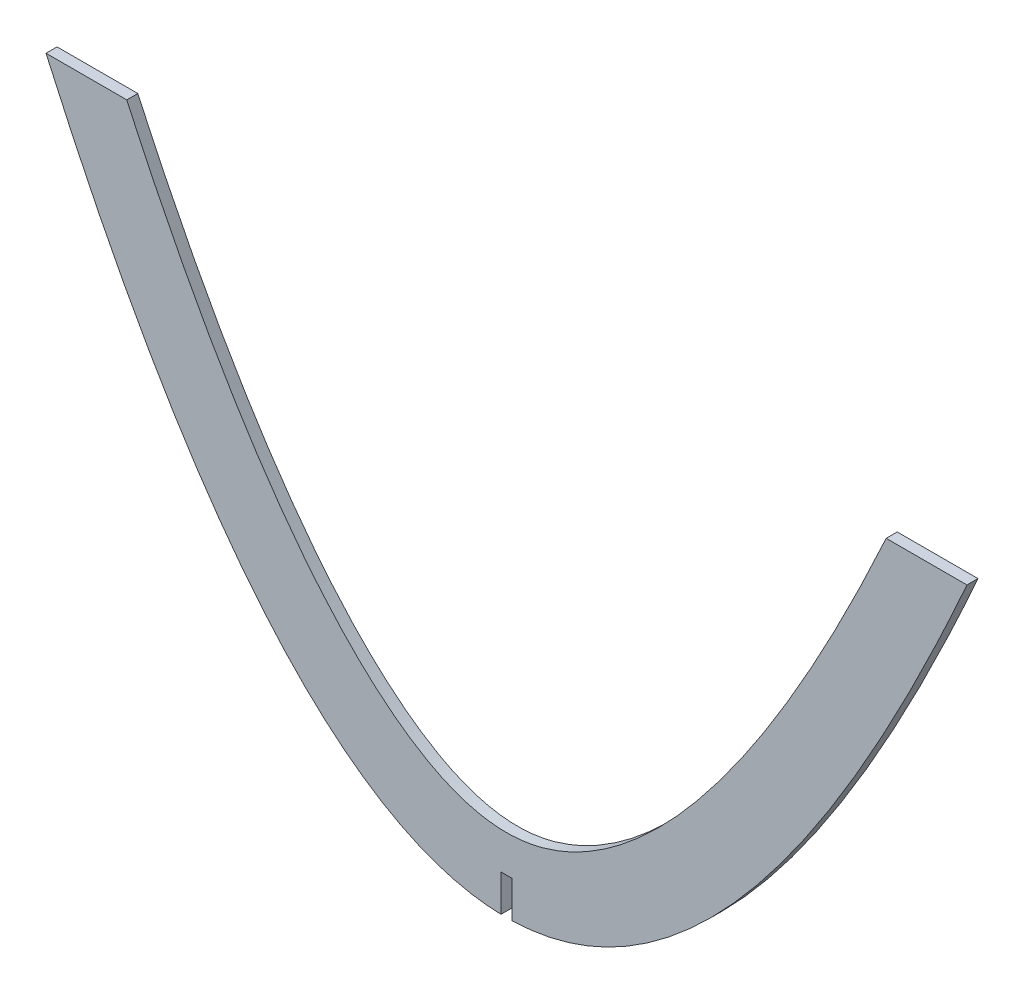
ISO-10303-21;
HEADER;
FILE_DESCRIPTION(('STEP AP214'),'2;1');
FILE_NAME('part.step','',(''),(''),'','','');
FILE_SCHEMA(('AUTOMOTIVE_DESIGN { 1 0 10303 214 1 1 1 1 }'));
ENDSEC;
DATA;
#1=APPLICATION_CONTEXT('core data for automotive mechanical design processes');
#2=APPLICATION_PROTOCOL_DEFINITION('international standard','automotive_design',2000,#1);
#3=PRODUCT_CONTEXT('',#1,'mechanical');
#4=PRODUCT('Part','Part','',(#3));
#5=PRODUCT_RELATED_PRODUCT_CATEGORY('part','',(#4));
#6=PRODUCT_DEFINITION_FORMATION('','',#4);
#7=PRODUCT_DEFINITION_CONTEXT('part definition',#1,'design');
#8=PRODUCT_DEFINITION('design','',#6,#7);
#9=PRODUCT_DEFINITION_SHAPE('','',#8);
#10=(LENGTH_UNIT() NAMED_UNIT(*) SI_UNIT(.MILLI.,.METRE.));
#11=(NAMED_UNIT(*) PLANE_ANGLE_UNIT() SI_UNIT($,.RADIAN.));
#12=(NAMED_UNIT(*) SI_UNIT($,.STERADIAN.) SOLID_ANGLE_UNIT());
#13=UNCERTAINTY_MEASURE_WITH_UNIT(LENGTH_MEASURE(1.E-05),#10,'distance_accuracy_value','');
#14=(GEOMETRIC_REPRESENTATION_CONTEXT(3) GLOBAL_UNCERTAINTY_ASSIGNED_CONTEXT((#13)) GLOBAL_UNIT_ASSIGNED_CONTEXT((#10,
#11,#12)) REPRESENTATION_CONTEXT('',''));
#15=CARTESIAN_POINT('',(0.,0.,0.));
#16=DIRECTION('',(0.,0.,1.));
#17=DIRECTION('',(1.,0.,0.));
#18=AXIS2_PLACEMENT_3D('',#15,#16,#17);
#19=CARTESIAN_POINT('',(-125.077753595806,140.800000001159,3.));
#20=CARTESIAN_POINT('',(-3.81221096357187E-10,-140.800000000301,3.));
#21=CARTESIAN_POINT('',(125.077753595044,140.799999999443,3.));
#22=B_SPLINE_CURVE_WITH_KNOTS('',2,(#19,#20,#21),.UNSPECIFIED.,.F.,.F.,(3,3),
(0.0543815127993418,0.945618487197942),.UNSPECIFIED.);
#23=DIRECTION('',(0.,0.,-1.));
#24=VECTOR('',#23,1.);
#25=SURFACE_OF_LINEAR_EXTRUSION('',#22,#24);
#26=DIRECTION('',(0.,0.,-1.));
#27=VECTOR('',#26,1.);
#28=CARTESIAN_POINT('',(-1.50000000000001,0.0202499999999815,3.));
#29=LINE('',#28,#27);
#30=CARTESIAN_POINT('',(-1.5,0.0202499999999821,3.));
#31=VERTEX_POINT('',#30);
#32=CARTESIAN_POINT('',(-1.5,0.0202499999999856,0.));
#33=VERTEX_POINT('',#32);
#34=EDGE_CURVE('E174',#31,#33,#29,.T.);
#35=ORIENTED_EDGE('',*,*,#34,.F.);
#36=CARTESIAN_POINT('',(-125.077753595764,140.800000001063,3.));
#37=VERTEX_POINT('',#36);
#38=EDGE_CURVE('E186',#37,#31,#22,.T.);
#39=ORIENTED_EDGE('',*,*,#38,.F.);
#40=DIRECTION('',(0.,0.,-1.));
#41=VECTOR('',#40,1.);
#42=CARTESIAN_POINT('',(-125.077753595764,140.800000001063,3.));
#43=LINE('',#42,#41);
#44=CARTESIAN_POINT('',(-125.077753595764,140.800000001063,0.));
#45=VERTEX_POINT('',#44);
#46=EDGE_CURVE('E164',#37,#45,#43,.T.);
#47=ORIENTED_EDGE('',*,*,#46,.T.);
#48=CARTESIAN_POINT('',(-125.077753595806,140.800000001159,0.));
#49=CARTESIAN_POINT('',(-3.81221096357187E-10,-140.800000000301,0.));
#50=CARTESIAN_POINT('',(125.077753595044,140.799999999443,0.));
#51=B_SPLINE_CURVE_WITH_KNOTS('',2,(#48,#49,#50),.UNSPECIFIED.,.F.,.F.,(3,3),
(0.0543815127993418,0.945618487197942),.UNSPECIFIED.);
#52=EDGE_CURVE('E140',#45,#33,#51,.T.);
#53=ORIENTED_EDGE('',*,*,#52,.T.);
#54=EDGE_LOOP('',(#35,#39,#47,#53));
#55=FACE_BOUND('',#54,.T.);
#56=ADVANCED_FACE('F38',(#55),#25,.F.);
#57=DIRECTION('',(0.,0.,-1.));
#58=VECTOR('',#57,1.);
#59=CARTESIAN_POINT('',(1.49999999999998,0.0202499999999831,3.));
#60=LINE('',#59,#58);
#61=CARTESIAN_POINT('',(1.5,0.020249999999989,0.));
#62=VERTEX_POINT('',#61);
#63=CARTESIAN_POINT('',(1.5,0.0202499999999856,3.));
#64=VERTEX_POINT('',#63);
#65=EDGE_CURVE('E274',#62,#64,#60,.F.);
#66=ORIENTED_EDGE('',*,*,#65,.F.);
#67=CARTESIAN_POINT('',(125.077753595044,140.799999999443,0.));
#68=VERTEX_POINT('',#67);
#69=EDGE_CURVE('E135',#62,#68,#51,.T.);
#70=ORIENTED_EDGE('',*,*,#69,.T.);
#71=DIRECTION('',(0.,0.,-1.));
#72=VECTOR('',#71,1.);
#73=CARTESIAN_POINT('',(125.077753595044,140.799999999443,3.));
#74=LINE('',#73,#72);
#75=CARTESIAN_POINT('',(125.077753595044,140.799999999443,3.));
#76=VERTEX_POINT('',#75);
#77=EDGE_CURVE('E161',#76,#68,#74,.T.);
#78=ORIENTED_EDGE('',*,*,#77,.F.);
#79=EDGE_CURVE('E193',#64,#76,#22,.T.);
#80=ORIENTED_EDGE('',*,*,#79,.F.);
#81=EDGE_LOOP('',(#66,#70,#78,#80));
#82=FACE_BOUND('',#81,.T.);
#83=ADVANCED_FACE('F200',(#82),#25,.F.);
#84=CARTESIAN_POINT('',(-1.71546593575288E-05,19.9977791773633,3.));
#85=DIRECTION('',(0.,0.,-1.));
#86=DIRECTION('',(-1.,0.,0.));
#87=AXIS2_PLACEMENT_3D('',#84,#85,#86);
#88=PLANE('',#87);
#89=DIRECTION('',(0.,-1.,0.));
#90=VECTOR('',#89,1.);
#91=CARTESIAN_POINT('',(-1.5,19.9977791773633,3.));
#92=LINE('',#91,#90);
#93=CARTESIAN_POINT('',(-1.5,10.,3.));
#94=VERTEX_POINT('',#93);
#95=EDGE_CURVE('E176',#94,#31,#92,.T.);
#96=ORIENTED_EDGE('',*,*,#95,.F.);
#97=DIRECTION('',(-1.,0.,0.));
#98=VECTOR('',#97,1.);
#99=CARTESIAN_POINT('',(-1.71546593575288E-05,10.,3.));
#100=LINE('',#99,#98);
#101=CARTESIAN_POINT('',(1.5,10.,3.));
#102=VERTEX_POINT('',#101);
#103=EDGE_CURVE('E124',#102,#94,#100,.T.);
#104=ORIENTED_EDGE('',*,*,#103,.F.);
#105=DIRECTION('',(0.,1.,0.));
#106=VECTOR('',#105,1.);
#107=CARTESIAN_POINT('',(1.5,19.9977791773633,3.));
#108=LINE('',#107,#106);
#109=EDGE_CURVE('E120',#64,#102,#108,.T.);
#110=ORIENTED_EDGE('',*,*,#109,.F.);
#111=ORIENTED_EDGE('',*,*,#79,.T.);
#112=DIRECTION('',(-1.,0.,0.));
#113=VECTOR('',#112,1.);
#114=CARTESIAN_POINT('',(125.077753595062,140.799999999483,3.));
#115=LINE('',#114,#113);
#116=CARTESIAN_POINT('',(103.138713337596,140.799999999483,3.));
#117=VERTEX_POINT('',#116);
#118=EDGE_CURVE('E64',#76,#117,#115,.T.);
#119=ORIENTED_EDGE('',*,*,#118,.T.);
#120=CARTESIAN_POINT('',(106.801021997654,148.918052659956,3.));
#121=CARTESIAN_POINT('',(95.3458206950504,123.145278492541,3.));
#122=CARTESIAN_POINT('',(72.8086539669155,81.9387190647237,3.));
#123=CARTESIAN_POINT('',(50.9166113330143,51.2367000667919,3.));
#124=CARTESIAN_POINT('',(33.8704600982133,34.5059113974283,3.));
#125=CARTESIAN_POINT('',(21.2897307709412,25.7128692218317,3.));
#126=CARTESIAN_POINT('',(11.4724055710418,21.6162584870297,3.));
#127=CARTESIAN_POINT('',(5.01080655593261,20.2610294026602,3.));
#128=CARTESIAN_POINT('',(-1.7438295991286E-05,19.9100293629082,3.));
#129=CARTESIAN_POINT('',(-5.0108391634316,20.2610278387968,3.));
#130=CARTESIAN_POINT('',(-11.4724535282227,21.6162540545015,3.));
#131=CARTESIAN_POINT('',(-21.2895881161987,25.7128712127015,3.));
#132=CARTESIAN_POINT('',(-33.8715317114538,34.5058483144333,3.));
#133=CARTESIAN_POINT('',(-47.50140823865,47.8908293367716,3.));
#134=CARTESIAN_POINT('',(-61.8179330666154,65.9956435532343,3.));
#135=CARTESIAN_POINT('',(-76.566426387653,88.8078981827159,3.));
#136=CARTESIAN_POINT('',(-95.3452370812342,123.144628089731,3.));
#137=CARTESIAN_POINT('',(-106.801098727962,148.918017518988,3.));
#138=B_SPLINE_CURVE_WITH_KNOTS('',2,(#120,#121,#122,#123,#124,#125,#126,#127,#128,#129,#130,
#131,#132,#133,#134,#135,#136,#137),.UNSPECIFIED.,.F.,.F.,(3,1,1,1,1,1,1,1,1,1,1,1,1,1,1,1,3),
(0.0543815127994947,0.137934979149355,0.221488445499215,0.305041911849076,0.360744222748982,
0.416446533648889,0.45822326682382,0.486074422273773,0.513925577723726,0.54177673317368,
0.58355346634861,0.639255777248517,0.694958088148424,0.750660399048331,0.806362709948238,
0.862065020848144,0.945618487198005),.UNSPECIFIED.);
#139=CARTESIAN_POINT('',(-103.138713338318,140.800000001063,3.));
#140=VERTEX_POINT('',#139);
#141=EDGE_CURVE('E157',#117,#140,#138,.T.);
#142=ORIENTED_EDGE('',*,*,#141,.T.);
#143=DIRECTION('',(-1.,0.,0.));
#144=VECTOR('',#143,1.);
#145=CARTESIAN_POINT('',(-125.077753595764,140.800000001063,3.));
#146=LINE('',#145,#144);
#147=EDGE_CURVE('E93',#140,#37,#146,.T.);
#148=ORIENTED_EDGE('',*,*,#147,.T.);
#149=ORIENTED_EDGE('',*,*,#38,.T.);
#150=EDGE_LOOP('',(#96,#104,#110,#111,#119,#142,#148,#149));
#151=FACE_BOUND('',#150,.T.);
#152=ADVANCED_FACE('F213',(#151),#88,.F.);
#153=CARTESIAN_POINT('',(-1.71546593575288E-05,19.9977791773633,0.));
#154=DIRECTION('',(0.,0.,-1.));
#155=DIRECTION('',(-1.,0.,0.));
#156=AXIS2_PLACEMENT_3D('',#153,#154,#155);
#157=PLANE('',#156);
#158=DIRECTION('',(-1.,0.,0.));
#159=VECTOR('',#158,1.);
#160=CARTESIAN_POINT('',(-1.5,10.,0.));
#161=LINE('',#160,#159);
#162=CARTESIAN_POINT('',(1.5,10.,0.));
#163=VERTEX_POINT('',#162);
#164=CARTESIAN_POINT('',(-1.5,10.,0.));
#165=VERTEX_POINT('',#164);
#166=EDGE_CURVE('E128',#163,#165,#161,.T.);
#167=ORIENTED_EDGE('',*,*,#166,.T.);
#168=DIRECTION('',(0.,-1.,0.));
#169=VECTOR('',#168,1.);
#170=CARTESIAN_POINT('',(-1.5,10.,0.));
#171=LINE('',#170,#169);
#172=EDGE_CURVE('E55',#165,#33,#171,.T.);
#173=ORIENTED_EDGE('',*,*,#172,.T.);
#174=ORIENTED_EDGE('',*,*,#52,.F.);
#175=DIRECTION('',(-1.,0.,0.));
#176=VECTOR('',#175,1.);
#177=CARTESIAN_POINT('',(-125.077753595764,140.800000001063,0.));
#178=LINE('',#177,#176);
#179=CARTESIAN_POINT('',(-103.138713338318,140.800000001063,0.));
#180=VERTEX_POINT('',#179);
#181=EDGE_CURVE('E141',#180,#45,#178,.T.);
#182=ORIENTED_EDGE('',*,*,#181,.F.);
#183=CARTESIAN_POINT('',(106.801021997654,148.918052659956,0.));
#184=CARTESIAN_POINT('',(95.3458206950504,123.145278492541,0.));
#185=CARTESIAN_POINT('',(72.8086539669155,81.9387190647237,0.));
#186=CARTESIAN_POINT('',(50.9166113330143,51.2367000667919,0.));
#187=CARTESIAN_POINT('',(33.8704600982133,34.5059113974283,0.));
#188=CARTESIAN_POINT('',(21.2897307709412,25.7128692218317,0.));
#189=CARTESIAN_POINT('',(11.4724055710418,21.6162584870297,0.));
#190=CARTESIAN_POINT('',(5.01080655593261,20.2610294026602,0.));
#191=CARTESIAN_POINT('',(-1.7438295991286E-05,19.9100293629082,0.));
#192=CARTESIAN_POINT('',(-5.0108391634316,20.2610278387968,0.));
#193=CARTESIAN_POINT('',(-11.4724535282227,21.6162540545015,0.));
#194=CARTESIAN_POINT('',(-21.2895881161987,25.7128712127015,0.));
#195=CARTESIAN_POINT('',(-33.8715317114538,34.5058483144333,0.));
#196=CARTESIAN_POINT('',(-47.50140823865,47.8908293367716,0.));
#197=CARTESIAN_POINT('',(-61.8179330666154,65.9956435532343,0.));
#198=CARTESIAN_POINT('',(-76.566426387653,88.8078981827159,0.));
#199=CARTESIAN_POINT('',(-95.3452370812342,123.144628089731,0.));
#200=CARTESIAN_POINT('',(-106.801098727962,148.918017518988,0.));
#201=B_SPLINE_CURVE_WITH_KNOTS('',2,(#183,#184,#185,#186,#187,#188,#189,#190,#191,#192,#193,
#194,#195,#196,#197,#198,#199,#200),.UNSPECIFIED.,.F.,.F.,(3,1,1,1,1,1,1,1,1,1,1,1,1,1,1,1,3),
(0.0543815127994947,0.137934979149355,0.221488445499215,0.305041911849076,0.360744222748982,
0.416446533648889,0.45822326682382,0.486074422273773,0.513925577723726,0.54177673317368,
0.58355346634861,0.639255777248517,0.694958088148424,0.750660399048331,0.806362709948238,
0.862065020848144,0.945618487198005),.UNSPECIFIED.);
#202=CARTESIAN_POINT('',(103.138713337596,140.799999999483,0.));
#203=VERTEX_POINT('',#202);
#204=EDGE_CURVE('E146',#203,#180,#201,.T.);
#205=ORIENTED_EDGE('',*,*,#204,.F.);
#206=DIRECTION('',(-1.,0.,0.));
#207=VECTOR('',#206,1.);
#208=CARTESIAN_POINT('',(125.077753595062,140.799999999483,0.));
#209=LINE('',#208,#207);
#210=EDGE_CURVE('E85',#68,#203,#209,.T.);
#211=ORIENTED_EDGE('',*,*,#210,.F.);
#212=ORIENTED_EDGE('',*,*,#69,.F.);
#213=DIRECTION('',(0.,1.,0.));
#214=VECTOR('',#213,1.);
#215=CARTESIAN_POINT('',(1.5,19.9977791773633,0.));
#216=LINE('',#215,#214);
#217=EDGE_CURVE('E11',#62,#163,#216,.T.);
#218=ORIENTED_EDGE('',*,*,#217,.T.);
#219=EDGE_LOOP('',(#167,#173,#174,#182,#205,#211,#212,#218));
#220=FACE_BOUND('',#219,.T.);
#221=ADVANCED_FACE('F134',(#220),#157,.T.);
#222=DIRECTION('',(0.,0.,-1.));
#223=VECTOR('',#222,1.);
#224=SURFACE_OF_LINEAR_EXTRUSION('',#138,#223);
#225=ORIENTED_EDGE('',*,*,#204,.T.);
#226=DIRECTION('',(0.,0.,-1.));
#227=VECTOR('',#226,1.);
#228=CARTESIAN_POINT('',(-103.138713338318,140.800000001063,3.));
#229=LINE('',#228,#227);
#230=EDGE_CURVE('E48',#140,#180,#229,.T.);
#231=ORIENTED_EDGE('',*,*,#230,.F.);
#232=ORIENTED_EDGE('',*,*,#141,.F.);
#233=DIRECTION('',(0.,0.,-1.));
#234=VECTOR('',#233,1.);
#235=CARTESIAN_POINT('',(103.138713337596,140.799999999483,3.));
#236=LINE('',#235,#234);
#237=EDGE_CURVE('E158',#117,#203,#236,.T.);
#238=ORIENTED_EDGE('',*,*,#237,.T.);
#239=EDGE_LOOP('',(#225,#231,#232,#238));
#240=FACE_BOUND('',#239,.T.);
#241=ADVANCED_FACE('F40',(#240),#224,.F.);
#242=CARTESIAN_POINT('',(-125.077753595764,140.800000001063,3.));
#243=DIRECTION('',(0.,-1.,0.));
#244=DIRECTION('',(0.,0.,-1.));
#245=AXIS2_PLACEMENT_3D('',#242,#243,#244);
#246=PLANE('',#245);
#247=ORIENTED_EDGE('',*,*,#181,.T.);
#248=ORIENTED_EDGE('',*,*,#46,.F.);
#249=ORIENTED_EDGE('',*,*,#147,.F.);
#250=ORIENTED_EDGE('',*,*,#230,.T.);
#251=EDGE_LOOP('',(#247,#248,#249,#250));
#252=FACE_BOUND('',#251,.T.);
#253=ADVANCED_FACE('F170',(#252),#246,.F.);
#254=CARTESIAN_POINT('',(125.077753595062,140.799999999483,3.));
#255=DIRECTION('',(0.,-1.,0.));
#256=DIRECTION('',(0.,0.,-1.));
#257=AXIS2_PLACEMENT_3D('',#254,#255,#256);
#258=PLANE('',#257);
#259=ORIENTED_EDGE('',*,*,#210,.T.);
#260=ORIENTED_EDGE('',*,*,#237,.F.);
#261=ORIENTED_EDGE('',*,*,#118,.F.);
#262=ORIENTED_EDGE('',*,*,#77,.T.);
#263=EDGE_LOOP('',(#259,#260,#261,#262));
#264=FACE_BOUND('',#263,.T.);
#265=ADVANCED_FACE('F202',(#264),#258,.F.);
#266=CARTESIAN_POINT('',(-1.5,10.,13.));
#267=DIRECTION('',(1.,0.,0.));
#268=DIRECTION('',(0.,0.,-1.));
#269=AXIS2_PLACEMENT_3D('',#266,#267,#268);
#270=PLANE('',#269);
#271=ORIENTED_EDGE('',*,*,#34,.T.);
#272=ORIENTED_EDGE('',*,*,#172,.F.);
#273=DIRECTION('',(0.,0.,-1.));
#274=VECTOR('',#273,1.);
#275=CARTESIAN_POINT('',(-1.5,10.,13.));
#276=LINE('',#275,#274);
#277=EDGE_CURVE('E125',#94,#165,#276,.T.);
#278=ORIENTED_EDGE('',*,*,#277,.F.);
#279=ORIENTED_EDGE('',*,*,#95,.T.);
#280=EDGE_LOOP('',(#271,#272,#278,#279));
#281=FACE_BOUND('',#280,.T.);
#282=ADVANCED_FACE('F209',(#281),#270,.T.);
#283=CARTESIAN_POINT('',(1.5,10.,13.));
#284=DIRECTION('',(-1.,0.,0.));
#285=DIRECTION('',(0.,0.,1.));
#286=AXIS2_PLACEMENT_3D('',#283,#284,#285);
#287=PLANE('',#286);
#288=ORIENTED_EDGE('',*,*,#65,.T.);
#289=ORIENTED_EDGE('',*,*,#109,.T.);
#290=DIRECTION('',(0.,0.,-1.));
#291=VECTOR('',#290,1.);
#292=CARTESIAN_POINT('',(1.5,10.,13.));
#293=LINE('',#292,#291);
#294=EDGE_CURVE('E115',#102,#163,#293,.T.);
#295=ORIENTED_EDGE('',*,*,#294,.T.);
#296=ORIENTED_EDGE('',*,*,#217,.F.);
#297=EDGE_LOOP('',(#288,#289,#295,#296));
#298=FACE_BOUND('',#297,.T.);
#299=ADVANCED_FACE('F117',(#298),#287,.T.);
#300=CARTESIAN_POINT('',(-1.5,10.,13.));
#301=DIRECTION('',(0.,-1.,0.));
#302=DIRECTION('',(0.,0.,-1.));
#303=AXIS2_PLACEMENT_3D('',#300,#301,#302);
#304=PLANE('',#303);
#305=ORIENTED_EDGE('',*,*,#103,.T.);
#306=ORIENTED_EDGE('',*,*,#277,.T.);
#307=ORIENTED_EDGE('',*,*,#166,.F.);
#308=ORIENTED_EDGE('',*,*,#294,.F.);
#309=EDGE_LOOP('',(#305,#306,#307,#308));
#310=FACE_BOUND('',#309,.T.);
#311=ADVANCED_FACE('F129',(#310),#304,.T.);
#312=CLOSED_SHELL('',(#56,#83,#152,#221,#241,#253,#265,#282,#299,#311));
#313=MANIFOLD_SOLID_BREP('B2',#312);
#314=ADVANCED_BREP_SHAPE_REPRESENTATION('',(#18,#313),#14);
#315=SHAPE_DEFINITION_REPRESENTATION(#9,#314);
ENDSEC;
END-ISO-10303-21;
